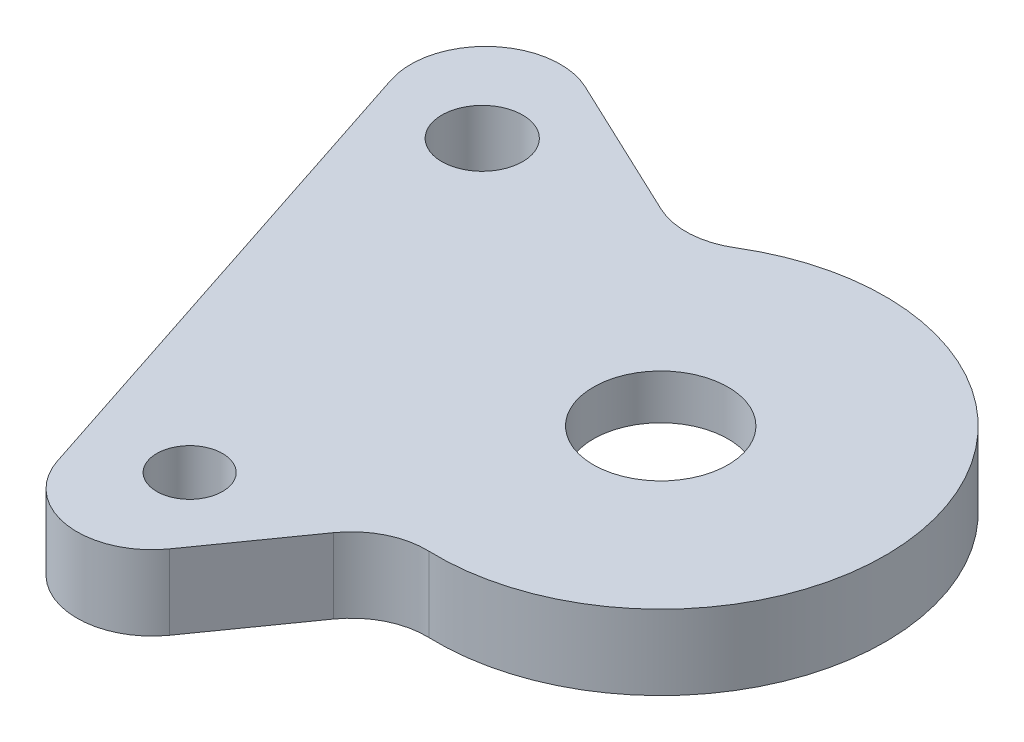
ISO-10303-21;
HEADER;
FILE_DESCRIPTION(('STEP AP214'),'2;1');
FILE_NAME('part.step','',(''),(''),'','','');
FILE_SCHEMA(('AUTOMOTIVE_DESIGN { 1 0 10303 214 1 1 1 1 }'));
ENDSEC;
DATA;
#1=APPLICATION_CONTEXT('core data for automotive mechanical design processes');
#2=APPLICATION_PROTOCOL_DEFINITION('international standard','automotive_design',2000,#1);
#3=PRODUCT_CONTEXT('',#1,'mechanical');
#4=PRODUCT('Part','Part','',(#3));
#5=PRODUCT_RELATED_PRODUCT_CATEGORY('part','',(#4));
#6=PRODUCT_DEFINITION_FORMATION('','',#4);
#7=PRODUCT_DEFINITION_CONTEXT('part definition',#1,'design');
#8=PRODUCT_DEFINITION('design','',#6,#7);
#9=PRODUCT_DEFINITION_SHAPE('','',#8);
#10=(LENGTH_UNIT() NAMED_UNIT(*) SI_UNIT(.MILLI.,.METRE.));
#11=(NAMED_UNIT(*) PLANE_ANGLE_UNIT() SI_UNIT($,.RADIAN.));
#12=(NAMED_UNIT(*) SI_UNIT($,.STERADIAN.) SOLID_ANGLE_UNIT());
#13=UNCERTAINTY_MEASURE_WITH_UNIT(LENGTH_MEASURE(1.E-05),#10,'distance_accuracy_value','');
#14=(GEOMETRIC_REPRESENTATION_CONTEXT(3) GLOBAL_UNCERTAINTY_ASSIGNED_CONTEXT((#13)) GLOBAL_UNIT_ASSIGNED_CONTEXT((#10,
#11,#12)) REPRESENTATION_CONTEXT('',''));
#15=CARTESIAN_POINT('',(0.,0.,0.));
#16=DIRECTION('',(0.,0.,1.));
#17=DIRECTION('',(1.,0.,0.));
#18=AXIS2_PLACEMENT_3D('',#15,#16,#17);
#19=CARTESIAN_POINT('',(0.,-25.,0.));
#20=DIRECTION('',(0.,1.,0.));
#21=DIRECTION('',(0.,0.,-1.));
#22=AXIS2_PLACEMENT_3D('',#19,#20,#21);
#23=CYLINDRICAL_SURFACE('',#22,12.);
#24=CARTESIAN_POINT('',(0.,-25.,0.));
#25=DIRECTION('',(0.,1.,0.));
#26=DIRECTION('',(0.,0.,1.));
#27=AXIS2_PLACEMENT_3D('',#24,#25,#26);
#28=CIRCLE('',#27,12.);
#29=CARTESIAN_POINT('',(-1.59644048502354,-25.,-11.8933333333333));
#30=VERTEX_POINT('',#29);
#31=CARTESIAN_POINT('',(-11.0981490448542,-25.,4.56410865100746));
#32=VERTEX_POINT('',#31);
#33=EDGE_CURVE('E149',#30,#32,#28,.T.);
#34=ORIENTED_EDGE('',*,*,#33,.F.);
#35=DIRECTION('',(0.,1.,0.));
#36=VECTOR('',#35,1.);
#37=CARTESIAN_POINT('',(-1.59644048502354,-28.7279048689119,-11.8933333333333));
#38=LINE('',#37,#36);
#39=CARTESIAN_POINT('',(-1.59644048502354,-22.,-11.8933333333333));
#40=VERTEX_POINT('',#39);
#41=EDGE_CURVE('E321',#30,#40,#38,.T.);
#42=ORIENTED_EDGE('',*,*,#41,.T.);
#43=CARTESIAN_POINT('',(0.,-22.,0.));
#44=DIRECTION('',(0.,1.,0.));
#45=DIRECTION('',(0.,0.,1.));
#46=AXIS2_PLACEMENT_3D('',#43,#44,#45);
#47=CIRCLE('',#46,12.);
#48=CARTESIAN_POINT('',(-11.0981490448542,-22.,4.56410865100746));
#49=VERTEX_POINT('',#48);
#50=EDGE_CURVE('E202',#40,#49,#47,.T.);
#51=ORIENTED_EDGE('',*,*,#50,.T.);
#52=DIRECTION('',(0.,1.,0.));
#53=VECTOR('',#52,1.);
#54=CARTESIAN_POINT('',(-11.0981490448542,-28.7279048689119,4.56410865100746));
#55=LINE('',#54,#53);
#56=EDGE_CURVE('E158',#32,#49,#55,.T.);
#57=ORIENTED_EDGE('',*,*,#56,.F.);
#58=EDGE_LOOP('',(#34,#42,#51,#57));
#59=FACE_BOUND('',#58,.T.);
#60=ADVANCED_FACE('F39',(#59),#23,.F.);
#61=CARTESIAN_POINT('',(-9.50170855983033,-22.,7.32922468232806));
#62=VERTEX_POINT('',#61);
#63=CARTESIAN_POINT('',(9.50170855983194,-22.,7.32922468232597));
#64=VERTEX_POINT('',#63);
#65=EDGE_CURVE('E206',#62,#64,#47,.T.);
#66=ORIENTED_EDGE('',*,*,#65,.T.);
#67=DIRECTION('',(0.,1.,0.));
#68=VECTOR('',#67,1.);
#69=CARTESIAN_POINT('',(9.50170855983194,-28.7279048689119,7.32922468232597));
#70=LINE('',#69,#68);
#71=CARTESIAN_POINT('',(9.50170855983195,-25.,7.32922468232596));
#72=VERTEX_POINT('',#71);
#73=EDGE_CURVE('E151',#72,#64,#70,.T.);
#74=ORIENTED_EDGE('',*,*,#73,.F.);
#75=CARTESIAN_POINT('',(-9.50170855983033,-25.,7.32922468232806));
#76=VERTEX_POINT('',#75);
#77=EDGE_CURVE('E146',#76,#72,#28,.T.);
#78=ORIENTED_EDGE('',*,*,#77,.F.);
#79=DIRECTION('',(0.,1.,0.));
#80=VECTOR('',#79,1.);
#81=CARTESIAN_POINT('',(-9.50170855983033,-28.7279048689119,7.32922468232806));
#82=LINE('',#81,#80);
#83=EDGE_CURVE('E153',#76,#62,#82,.T.);
#84=ORIENTED_EDGE('',*,*,#83,.T.);
#85=EDGE_LOOP('',(#66,#74,#78,#84));
#86=FACE_BOUND('',#85,.T.);
#87=ADVANCED_FACE('F160',(#86),#23,.F.);
#88=CARTESIAN_POINT('',(11.0981490448552,-22.,4.56410865100517));
#89=VERTEX_POINT('',#88);
#90=CARTESIAN_POINT('',(1.59644048502354,-22.,-11.8933333333333));
#91=VERTEX_POINT('',#90);
#92=EDGE_CURVE('E184',#89,#91,#47,.T.);
#93=ORIENTED_EDGE('',*,*,#92,.T.);
#94=DIRECTION('',(0.,1.,0.));
#95=VECTOR('',#94,1.);
#96=CARTESIAN_POINT('',(1.59644048502354,-28.7279048689119,-11.8933333333333));
#97=LINE('',#96,#95);
#98=CARTESIAN_POINT('',(1.59644048502355,-25.,-11.8933333333333));
#99=VERTEX_POINT('',#98);
#100=EDGE_CURVE('E306',#99,#91,#97,.T.);
#101=ORIENTED_EDGE('',*,*,#100,.F.);
#102=CARTESIAN_POINT('',(11.0981490448552,-25.,4.56410865100517));
#103=VERTEX_POINT('',#102);
#104=EDGE_CURVE('E161',#103,#99,#28,.T.);
#105=ORIENTED_EDGE('',*,*,#104,.F.);
#106=DIRECTION('',(0.,1.,0.));
#107=VECTOR('',#106,1.);
#108=CARTESIAN_POINT('',(11.0981490448552,-28.7279048689119,4.56410865100517));
#109=LINE('',#108,#107);
#110=EDGE_CURVE('E307',#103,#89,#109,.T.);
#111=ORIENTED_EDGE('',*,*,#110,.T.);
#112=EDGE_LOOP('',(#93,#101,#105,#111));
#113=FACE_BOUND('',#112,.T.);
#114=ADVANCED_FACE('F290',(#113),#23,.F.);
#115=CARTESIAN_POINT('',(4.89755338496311,-25.,3.4661175458193));
#116=DIRECTION('',(0.816258897493851,0.,0.57768625763655));
#117=DIRECTION('',(0.57768625763655,0.,-0.816258897493851));
#118=AXIS2_PLACEMENT_3D('',#115,#116,#117);
#119=PLANE('',#118);
#120=DIRECTION('',(-0.57768625763655,0.,0.816258897493851));
#121=VECTOR('',#120,1.);
#122=CARTESIAN_POINT('',(4.89755338496311,-20.,3.4661175458193));
#123=LINE('',#122,#121);
#124=CARTESIAN_POINT('',(-4.75170948953318,-20.,17.1003291467469));
#125=VERTEX_POINT('',#124);
#126=CARTESIAN_POINT('',(-9.29348969687176,-20.,23.5177719293896));
#127=VERTEX_POINT('',#126);
#128=EDGE_CURVE('E185',#125,#127,#123,.T.);
#129=ORIENTED_EDGE('',*,*,#128,.T.);
#130=DIRECTION('',(0.,1.,0.));
#131=VECTOR('',#130,1.);
#132=CARTESIAN_POINT('',(-9.29348969687176,-25.,23.5177719293896));
#133=LINE('',#132,#131);
#134=CARTESIAN_POINT('',(-9.29348969687176,-25.,23.5177719293896));
#135=VERTEX_POINT('',#134);
#136=EDGE_CURVE('E223',#135,#127,#133,.T.);
#137=ORIENTED_EDGE('',*,*,#136,.F.);
#138=DIRECTION('',(-0.57768625763655,0.,0.816258897493851));
#139=VECTOR('',#138,1.);
#140=CARTESIAN_POINT('',(4.89755338496311,-25.,3.4661175458193));
#141=LINE('',#140,#139);
#142=CARTESIAN_POINT('',(-4.75170948953318,-25.,17.1003291467469));
#143=VERTEX_POINT('',#142);
#144=EDGE_CURVE('E163',#143,#135,#141,.T.);
#145=ORIENTED_EDGE('',*,*,#144,.F.);
#146=DIRECTION('',(0.,1.,0.));
#147=VECTOR('',#146,1.);
#148=CARTESIAN_POINT('',(-4.75170948953318,-25.,17.1003291467469));
#149=LINE('',#148,#147);
#150=EDGE_CURVE('E235',#125,#143,#149,.F.);
#151=ORIENTED_EDGE('',*,*,#150,.F.);
#152=EDGE_LOOP('',(#129,#137,#145,#151));
#153=FACE_BOUND('',#152,.T.);
#154=ADVANCED_FACE('F261',(#153),#119,.T.);
#155=CARTESIAN_POINT('',(0.,-25.,0.));
#156=DIRECTION('',(0.,1.,0.));
#157=DIRECTION('',(0.,0.,-1.));
#158=AXIS2_PLACEMENT_3D('',#155,#156,#157);
#159=CYLINDRICAL_SURFACE('',#158,15.);
#160=CARTESIAN_POINT('',(0.,-20.,0.));
#161=DIRECTION('',(0.,1.,0.));
#162=DIRECTION('',(0.,0.,1.));
#163=AXIS2_PLACEMENT_3D('',#160,#161,#162);
#164=CIRCLE('',#163,15.);
#165=CARTESIAN_POINT('',(-0.502811251547942,-20.,14.9915703261972));
#166=VERTEX_POINT('',#165);
#167=CARTESIAN_POINT('',(-7.8028543625734,-20.,-12.8107557855292));
#168=VERTEX_POINT('',#167);
#169=EDGE_CURVE('E188',#166,#168,#164,.T.);
#170=ORIENTED_EDGE('',*,*,#169,.F.);
#171=DIRECTION('',(0.,1.,0.));
#172=VECTOR('',#171,1.);
#173=CARTESIAN_POINT('',(-0.502811251547942,-25.,14.9915703261972));
#174=LINE('',#173,#172);
#175=CARTESIAN_POINT('',(-0.502811251547942,-25.,14.9915703261972));
#176=VERTEX_POINT('',#175);
#177=EDGE_CURVE('E229',#176,#166,#174,.T.);
#178=ORIENTED_EDGE('',*,*,#177,.F.);
#179=CARTESIAN_POINT('',(0.,-25.,0.));
#180=DIRECTION('',(0.,1.,0.));
#181=DIRECTION('',(0.,0.,1.));
#182=AXIS2_PLACEMENT_3D('',#179,#180,#181);
#183=CIRCLE('',#182,15.);
#184=CARTESIAN_POINT('',(-7.8028543625734,-25.,-12.8107557855292));
#185=VERTEX_POINT('',#184);
#186=EDGE_CURVE('E172',#176,#185,#183,.T.);
#187=ORIENTED_EDGE('',*,*,#186,.T.);
#188=DIRECTION('',(0.,1.,0.));
#189=VECTOR('',#188,1.);
#190=CARTESIAN_POINT('',(-7.8028543625734,-25.,-12.8107557855292));
#191=LINE('',#190,#189);
#192=EDGE_CURVE('E232',#168,#185,#191,.F.);
#193=ORIENTED_EDGE('',*,*,#192,.F.);
#194=EDGE_LOOP('',(#170,#178,#187,#193));
#195=FACE_BOUND('',#194,.T.);
#196=ADVANCED_FACE('F253',(#195),#159,.T.);
#197=CARTESIAN_POINT('',(2.56300821164913,-25.,-5.42503353971376));
#198=DIRECTION('',(0.427168035274854,0.,-0.904172256618959));
#199=DIRECTION('',(-0.904172256618959,0.,-0.427168035274854));
#200=AXIS2_PLACEMENT_3D('',#197,#198,#199);
#201=PLANE('',#200);
#202=DIRECTION('',(0.904172256618959,0.,0.427168035274854));
#203=VECTOR('',#202,1.);
#204=CARTESIAN_POINT('',(2.56300821164913,-25.,-5.42503353971376));
#205=LINE('',#204,#203);
#206=CARTESIAN_POINT('',(-22.1442331079006,-25.,-17.097747067775));
#207=VERTEX_POINT('',#206);
#208=CARTESIAN_POINT('',(-12.5396459931388,-25.,-12.5601464309441));
#209=VERTEX_POINT('',#208);
#210=EDGE_CURVE('E175',#207,#209,#205,.T.);
#211=ORIENTED_EDGE('',*,*,#210,.F.);
#212=DIRECTION('',(0.,1.,0.));
#213=VECTOR('',#212,1.);
#214=CARTESIAN_POINT('',(-22.1442331079006,-25.,-17.097747067775));
#215=LINE('',#214,#213);
#216=CARTESIAN_POINT('',(-22.1442331079006,-20.,-17.097747067775));
#217=VERTEX_POINT('',#216);
#218=EDGE_CURVE('E216',#217,#207,#215,.F.);
#219=ORIENTED_EDGE('',*,*,#218,.F.);
#220=DIRECTION('',(0.904172256618959,0.,0.427168035274854));
#221=VECTOR('',#220,1.);
#222=CARTESIAN_POINT('',(2.56300821164913,-20.,-5.42503353971376));
#223=LINE('',#222,#221);
#224=CARTESIAN_POINT('',(-12.5396459931388,-20.,-12.5601464309441));
#225=VERTEX_POINT('',#224);
#226=EDGE_CURVE('E191',#217,#225,#223,.T.);
#227=ORIENTED_EDGE('',*,*,#226,.T.);
#228=DIRECTION('',(0.,1.,0.));
#229=VECTOR('',#228,1.);
#230=CARTESIAN_POINT('',(-12.5396459931388,-25.,-12.5601464309441));
#231=LINE('',#230,#229);
#232=EDGE_CURVE('E226',#209,#225,#231,.T.);
#233=ORIENTED_EDGE('',*,*,#232,.F.);
#234=EDGE_LOOP('',(#211,#219,#227,#233));
#235=FACE_BOUND('',#234,.T.);
#236=ADVANCED_FACE('F276',(#235),#201,.T.);
#237=CARTESIAN_POINT('',(-13.0441556974333,-25.,18.4311259054112));
#238=DIRECTION('',(0.,1.,0.));
#239=DIRECTION('',(0.,0.,-1.));
#240=AXIS2_PLACEMENT_3D('',#237,#238,#239);
#241=CYLINDRICAL_SURFACE('',#240,2.2);
#242=CARTESIAN_POINT('',(-13.0441556974333,-25.,18.4311259054112));
#243=DIRECTION('',(0.,1.,0.));
#244=DIRECTION('',(0.,0.,1.));
#245=AXIS2_PLACEMENT_3D('',#242,#243,#244);
#246=CIRCLE('',#245,2.2);
#247=CARTESIAN_POINT('',(-13.0441556974333,-25.,20.6311259054112));
#248=VERTEX_POINT('',#247);
#249=EDGE_CURVE('E181',#248,#248,#246,.T.);
#250=ORIENTED_EDGE('',*,*,#249,.F.);
#251=EDGE_LOOP('',(#250));
#252=FACE_BOUND('',#251,.T.);
#253=CARTESIAN_POINT('',(-13.0441556974333,-20.,18.4311259054112));
#254=DIRECTION('',(0.,1.,0.));
#255=DIRECTION('',(0.,0.,1.));
#256=AXIS2_PLACEMENT_3D('',#253,#254,#255);
#257=CIRCLE('',#256,2.2);
#258=CARTESIAN_POINT('',(-13.0441556974333,-20.,20.6311259054112));
#259=VERTEX_POINT('',#258);
#260=EDGE_CURVE('E197',#259,#259,#257,.T.);
#261=ORIENTED_EDGE('',*,*,#260,.T.);
#262=EDGE_LOOP('',(#261));
#263=FACE_BOUND('',#262,.T.);
#264=ADVANCED_FACE('F361',(#252,#263),#241,.F.);
#265=CARTESIAN_POINT('',(-22.9384223712889,-25.,7.53322958914367));
#266=DIRECTION('',(-0.950076947783487,0.,0.31201569398095));
#267=DIRECTION('',(0.31201569398095,0.,0.950076947783487));
#268=AXIS2_PLACEMENT_3D('',#265,#266,#267);
#269=PLANE('',#268);
#270=DIRECTION('',(-0.31201569398095,0.,-0.950076947783487));
#271=VECTOR('',#270,1.);
#272=CARTESIAN_POINT('',(-22.9384223712889,-25.,7.53322958914367));
#273=LINE('',#272,#271);
#274=CARTESIAN_POINT('',(-18.1251689232584,-25.,22.1894191111116));
#275=VERTEX_POINT('',#274);
#276=CARTESIAN_POINT('',(-29.0304580231923,-25.,-11.0168073147754));
#277=VERTEX_POINT('',#276);
#278=EDGE_CURVE('E178',#275,#277,#273,.T.);
#279=ORIENTED_EDGE('',*,*,#278,.F.);
#280=DIRECTION('',(0.,1.,0.));
#281=VECTOR('',#280,1.);
#282=CARTESIAN_POINT('',(-18.1251689232584,-25.,22.1894191111116));
#283=LINE('',#282,#281);
#284=CARTESIAN_POINT('',(-18.1251689232584,-20.,22.1894191111116));
#285=VERTEX_POINT('',#284);
#286=EDGE_CURVE('E205',#285,#275,#283,.F.);
#287=ORIENTED_EDGE('',*,*,#286,.F.);
#288=DIRECTION('',(-0.31201569398095,0.,-0.950076947783487));
#289=VECTOR('',#288,1.);
#290=CARTESIAN_POINT('',(-22.9384223712889,-20.,7.53322958914367));
#291=LINE('',#290,#289);
#292=CARTESIAN_POINT('',(-29.0304580231923,-20.,-11.0168073147754));
#293=VERTEX_POINT('',#292);
#294=EDGE_CURVE('E194',#285,#293,#291,.T.);
#295=ORIENTED_EDGE('',*,*,#294,.T.);
#296=DIRECTION('',(0.,1.,0.));
#297=VECTOR('',#296,1.);
#298=CARTESIAN_POINT('',(-29.0304580231923,-25.,-11.0168073147754));
#299=LINE('',#298,#297);
#300=EDGE_CURVE('E209',#277,#293,#299,.T.);
#301=ORIENTED_EDGE('',*,*,#300,.F.);
#302=EDGE_LOOP('',(#279,#287,#295,#301));
#303=FACE_BOUND('',#302,.T.);
#304=ADVANCED_FACE('F269',(#303),#269,.T.);
#305=CARTESIAN_POINT('',(-22.604306415474,-25.,-10.6792008818714));
#306=DIRECTION('',(0.,1.,0.));
#307=DIRECTION('',(0.,0.,-1.));
#308=AXIS2_PLACEMENT_3D('',#305,#306,#307);
#309=CYLINDRICAL_SURFACE('',#308,2.7);
#310=CARTESIAN_POINT('',(-22.604306415474,-20.,-10.6792008818714));
#311=DIRECTION('',(0.,1.,0.));
#312=DIRECTION('',(0.,0.,1.));
#313=AXIS2_PLACEMENT_3D('',#310,#311,#312);
#314=CIRCLE('',#313,2.7);
#315=CARTESIAN_POINT('',(-22.604306415474,-20.,-7.97920088187135));
#316=VERTEX_POINT('',#315);
#317=EDGE_CURVE('E165',#316,#316,#314,.T.);
#318=ORIENTED_EDGE('',*,*,#317,.T.);
#319=EDGE_LOOP('',(#318));
#320=FACE_BOUND('',#319,.T.);
#321=CARTESIAN_POINT('',(-22.604306415474,-26.,-10.6792008818714));
#322=DIRECTION('',(0.,1.,0.));
#323=DIRECTION('',(0.,0.,1.));
#324=AXIS2_PLACEMENT_3D('',#321,#322,#323);
#325=CIRCLE('',#324,2.7);
#326=CARTESIAN_POINT('',(-22.604306415474,-26.,-7.97920088187135));
#327=VERTEX_POINT('',#326);
#328=EDGE_CURVE('E333',#327,#327,#325,.F.);
#329=ORIENTED_EDGE('',*,*,#328,.T.);
#330=EDGE_LOOP('',(#329));
#331=FACE_BOUND('',#330,.T.);
#332=ADVANCED_FACE('F354',(#320,#331),#309,.F.);
#333=CARTESIAN_POINT('',(0.,-25.,0.));
#334=DIRECTION('',(0.,-1.,0.));
#335=DIRECTION('',(0.,0.,1.));
#336=AXIS2_PLACEMENT_3D('',#333,#334,#335);
#337=PLANE('',#336);
#338=CARTESIAN_POINT('',(-22.604306415474,-25.,-10.6792008818714));
#339=DIRECTION('',(0.,1.,0.));
#340=DIRECTION('',(0.,0.,1.));
#341=AXIS2_PLACEMENT_3D('',#338,#339,#340);
#342=CIRCLE('',#341,5.7);
#343=CARTESIAN_POINT('',(-22.604306415474,-25.,-4.97920088187135));
#344=VERTEX_POINT('',#343);
#345=EDGE_CURVE('E11',#344,#344,#342,.F.);
#346=ORIENTED_EDGE('',*,*,#345,.F.);
#347=EDGE_LOOP('',(#346));
#348=FACE_BOUND('',#347,.T.);
#349=ORIENTED_EDGE('',*,*,#33,.T.);
#350=CARTESIAN_POINT('',(-10.392304845412,-25.,6.00000000000074));
#351=DIRECTION('',(0.,1.,0.));
#352=DIRECTION('',(0.,0.,1.));
#353=AXIS2_PLACEMENT_3D('',#350,#351,#352);
#354=CIRCLE('',#353,1.6);
#355=EDGE_CURVE('E142',#76,#32,#354,.T.);
#356=ORIENTED_EDGE('',*,*,#355,.F.);
#357=ORIENTED_EDGE('',*,*,#77,.T.);
#358=CARTESIAN_POINT('',(10.3923048454145,-25.,5.99999999999926));
#359=DIRECTION('',(0.,1.,0.));
#360=DIRECTION('',(0.,0.,1.));
#361=AXIS2_PLACEMENT_3D('',#358,#359,#360);
#362=CIRCLE('',#361,1.6);
#363=EDGE_CURVE('E311',#103,#72,#362,.T.);
#364=ORIENTED_EDGE('',*,*,#363,.F.);
#365=ORIENTED_EDGE('',*,*,#104,.T.);
#366=CARTESIAN_POINT('',(0.,-25.,-12.));
#367=DIRECTION('',(0.,1.,0.));
#368=DIRECTION('',(0.,0.,1.));
#369=AXIS2_PLACEMENT_3D('',#366,#367,#368);
#370=CIRCLE('',#369,1.6);
#371=EDGE_CURVE('E320',#30,#99,#370,.T.);
#372=ORIENTED_EDGE('',*,*,#371,.F.);
#373=EDGE_LOOP('',(#349,#356,#357,#364,#365,#372));
#374=FACE_BOUND('',#373,.T.);
#375=ORIENTED_EDGE('',*,*,#210,.T.);
#376=CARTESIAN_POINT('',(-10.4038058167645,-25.,-17.0810077140389));
#377=DIRECTION('',(0.,1.,0.));
#378=DIRECTION('',(0.,0.,1.));
#379=AXIS2_PLACEMENT_3D('',#376,#377,#378);
#380=CIRCLE('',#379,5.);
#381=EDGE_CURVE('E240',#185,#209,#380,.F.);
#382=ORIENTED_EDGE('',*,*,#381,.F.);
#383=ORIENTED_EDGE('',*,*,#186,.F.);
#384=CARTESIAN_POINT('',(-0.670415002063923,-25.,19.9887604349296));
#385=DIRECTION('',(0.,1.,0.));
#386=DIRECTION('',(0.,0.,1.));
#387=AXIS2_PLACEMENT_3D('',#384,#385,#386);
#388=CIRCLE('',#387,5.);
#389=EDGE_CURVE('E47',#143,#176,#388,.F.);
#390=ORIENTED_EDGE('',*,*,#389,.F.);
#391=ORIENTED_EDGE('',*,*,#144,.T.);
#392=CARTESIAN_POINT('',(-13.374784184341,-25.,20.6293406412069));
#393=DIRECTION('',(0.,1.,0.));
#394=DIRECTION('',(0.,0.,1.));
#395=AXIS2_PLACEMENT_3D('',#392,#393,#394);
#396=CIRCLE('',#395,5.);
#397=EDGE_CURVE('E219',#275,#135,#396,.T.);
#398=ORIENTED_EDGE('',*,*,#397,.F.);
#399=ORIENTED_EDGE('',*,*,#278,.T.);
#400=CARTESIAN_POINT('',(-24.2800732842749,-25.,-12.5768857846802));
#401=DIRECTION('',(0.,1.,0.));
#402=DIRECTION('',(0.,0.,1.));
#403=AXIS2_PLACEMENT_3D('',#400,#401,#402);
#404=CIRCLE('',#403,5.);
#405=EDGE_CURVE('E221',#207,#277,#404,.T.);
#406=ORIENTED_EDGE('',*,*,#405,.F.);
#407=EDGE_LOOP('',(#375,#382,#383,#390,#391,#398,#399,#406));
#408=FACE_BOUND('',#407,.T.);
#409=ORIENTED_EDGE('',*,*,#249,.T.);
#410=EDGE_LOOP('',(#409));
#411=FACE_BOUND('',#410,.T.);
#412=ADVANCED_FACE('F143',(#348,#374,#408,#411),#337,.T.);
#413=CARTESIAN_POINT('',(0.,-20.,0.));
#414=DIRECTION('',(0.,-1.,0.));
#415=DIRECTION('',(0.,0.,1.));
#416=AXIS2_PLACEMENT_3D('',#413,#414,#415);
#417=PLANE('',#416);
#418=ORIENTED_EDGE('',*,*,#294,.F.);
#419=CARTESIAN_POINT('',(-13.374784184341,-20.,20.6293406412069));
#420=DIRECTION('',(0.,1.,0.));
#421=DIRECTION('',(0.,0.,1.));
#422=AXIS2_PLACEMENT_3D('',#419,#420,#421);
#423=CIRCLE('',#422,5.);
#424=EDGE_CURVE('E212',#127,#285,#423,.F.);
#425=ORIENTED_EDGE('',*,*,#424,.F.);
#426=ORIENTED_EDGE('',*,*,#128,.F.);
#427=CARTESIAN_POINT('',(-0.670415002063923,-20.,19.9887604349296));
#428=DIRECTION('',(0.,1.,0.));
#429=DIRECTION('',(0.,0.,1.));
#430=AXIS2_PLACEMENT_3D('',#427,#428,#429);
#431=CIRCLE('',#430,5.);
#432=EDGE_CURVE('E242',#166,#125,#431,.T.);
#433=ORIENTED_EDGE('',*,*,#432,.F.);
#434=ORIENTED_EDGE('',*,*,#169,.T.);
#435=CARTESIAN_POINT('',(-10.4038058167645,-20.,-17.0810077140389));
#436=DIRECTION('',(0.,1.,0.));
#437=DIRECTION('',(0.,0.,1.));
#438=AXIS2_PLACEMENT_3D('',#435,#436,#437);
#439=CIRCLE('',#438,5.);
#440=EDGE_CURVE('E238',#225,#168,#439,.T.);
#441=ORIENTED_EDGE('',*,*,#440,.F.);
#442=ORIENTED_EDGE('',*,*,#226,.F.);
#443=CARTESIAN_POINT('',(-24.2800732842749,-20.,-12.5768857846802));
#444=DIRECTION('',(0.,1.,0.));
#445=DIRECTION('',(0.,0.,1.));
#446=AXIS2_PLACEMENT_3D('',#443,#444,#445);
#447=CIRCLE('',#446,5.);
#448=EDGE_CURVE('E214',#293,#217,#447,.F.);
#449=ORIENTED_EDGE('',*,*,#448,.F.);
#450=EDGE_LOOP('',(#418,#425,#426,#433,#434,#441,#442,#449));
#451=FACE_BOUND('',#450,.T.);
#452=ORIENTED_EDGE('',*,*,#260,.F.);
#453=EDGE_LOOP('',(#452));
#454=FACE_BOUND('',#453,.T.);
#455=ORIENTED_EDGE('',*,*,#317,.F.);
#456=EDGE_LOOP('',(#455));
#457=FACE_BOUND('',#456,.T.);
#458=CARTESIAN_POINT('',(0.,-20.,0.));
#459=DIRECTION('',(0.,1.,0.));
#460=DIRECTION('',(0.,0.,1.));
#461=AXIS2_PLACEMENT_3D('',#458,#459,#460);
#462=CIRCLE('',#461,4.5);
#463=CARTESIAN_POINT('',(0.,-20.,4.5));
#464=VERTEX_POINT('',#463);
#465=EDGE_CURVE('E168',#464,#464,#462,.T.);
#466=ORIENTED_EDGE('',*,*,#465,.F.);
#467=EDGE_LOOP('',(#466));
#468=FACE_BOUND('',#467,.T.);
#469=ADVANCED_FACE('F256',(#451,#454,#457,#468),#417,.F.);
#470=CARTESIAN_POINT('',(0.,-22.,0.));
#471=DIRECTION('',(0.,1.,0.));
#472=DIRECTION('',(0.,0.,-1.));
#473=AXIS2_PLACEMENT_3D('',#470,#471,#472);
#474=CYLINDRICAL_SURFACE('',#473,4.5);
#475=ORIENTED_EDGE('',*,*,#465,.T.);
#476=EDGE_LOOP('',(#475));
#477=FACE_BOUND('',#476,.T.);
#478=CARTESIAN_POINT('',(0.,-23.,0.));
#479=DIRECTION('',(0.,1.,0.));
#480=DIRECTION('',(0.,0.,1.));
#481=AXIS2_PLACEMENT_3D('',#478,#479,#480);
#482=CIRCLE('',#481,4.5);
#483=CARTESIAN_POINT('',(0.,-23.,4.5));
#484=VERTEX_POINT('',#483);
#485=EDGE_CURVE('E327',#484,#484,#482,.F.);
#486=ORIENTED_EDGE('',*,*,#485,.T.);
#487=EDGE_LOOP('',(#486));
#488=FACE_BOUND('',#487,.T.);
#489=ADVANCED_FACE('F344',(#477,#488),#474,.F.);
#490=CARTESIAN_POINT('',(0.,-22.,0.));
#491=DIRECTION('',(0.,-1.,0.));
#492=DIRECTION('',(0.,0.,1.));
#493=AXIS2_PLACEMENT_3D('',#490,#491,#492);
#494=PLANE('',#493);
#495=CARTESIAN_POINT('',(0.,-22.,0.));
#496=DIRECTION('',(0.,1.,0.));
#497=DIRECTION('',(0.,0.,1.));
#498=AXIS2_PLACEMENT_3D('',#495,#496,#497);
#499=CIRCLE('',#498,6.5);
#500=CARTESIAN_POINT('',(0.,-22.,6.5));
#501=VERTEX_POINT('',#500);
#502=EDGE_CURVE('E323',#501,#501,#499,.T.);
#503=ORIENTED_EDGE('',*,*,#502,.T.);
#504=EDGE_LOOP('',(#503));
#505=FACE_BOUND('',#504,.T.);
#506=ORIENTED_EDGE('',*,*,#50,.F.);
#507=CARTESIAN_POINT('',(0.,-22.,-12.));
#508=DIRECTION('',(0.,1.,0.));
#509=DIRECTION('',(0.,0.,1.));
#510=AXIS2_PLACEMENT_3D('',#507,#508,#509);
#511=CIRCLE('',#510,1.6);
#512=EDGE_CURVE('E318',#40,#91,#511,.T.);
#513=ORIENTED_EDGE('',*,*,#512,.T.);
#514=ORIENTED_EDGE('',*,*,#92,.F.);
#515=CARTESIAN_POINT('',(10.3923048454145,-22.,5.99999999999926));
#516=DIRECTION('',(0.,1.,0.));
#517=DIRECTION('',(0.,0.,1.));
#518=AXIS2_PLACEMENT_3D('',#515,#516,#517);
#519=CIRCLE('',#518,1.6);
#520=EDGE_CURVE('E62',#89,#64,#519,.T.);
#521=ORIENTED_EDGE('',*,*,#520,.T.);
#522=ORIENTED_EDGE('',*,*,#65,.F.);
#523=CARTESIAN_POINT('',(-10.392304845412,-22.,6.00000000000074));
#524=DIRECTION('',(0.,1.,0.));
#525=DIRECTION('',(0.,0.,1.));
#526=AXIS2_PLACEMENT_3D('',#523,#524,#525);
#527=CIRCLE('',#526,1.6);
#528=EDGE_CURVE('E54',#62,#49,#527,.T.);
#529=ORIENTED_EDGE('',*,*,#528,.T.);
#530=EDGE_LOOP('',(#506,#513,#514,#521,#522,#529));
#531=FACE_BOUND('',#530,.T.);
#532=ADVANCED_FACE('F310',(#505,#531),#494,.T.);
#533=CARTESIAN_POINT('',(-24.2800732842749,-25.,-12.5768857846802));
#534=DIRECTION('',(0.,1.,0.));
#535=DIRECTION('',(0.,0.,-1.));
#536=AXIS2_PLACEMENT_3D('',#533,#534,#535);
#537=CYLINDRICAL_SURFACE('',#536,5.);
#538=ORIENTED_EDGE('',*,*,#405,.T.);
#539=ORIENTED_EDGE('',*,*,#300,.T.);
#540=ORIENTED_EDGE('',*,*,#448,.T.);
#541=ORIENTED_EDGE('',*,*,#218,.T.);
#542=EDGE_LOOP('',(#538,#539,#540,#541));
#543=FACE_BOUND('',#542,.T.);
#544=ADVANCED_FACE('F271',(#543),#537,.T.);
#545=CARTESIAN_POINT('',(-13.374784184341,-25.,20.6293406412069));
#546=DIRECTION('',(0.,1.,0.));
#547=DIRECTION('',(0.,0.,-1.));
#548=AXIS2_PLACEMENT_3D('',#545,#546,#547);
#549=CYLINDRICAL_SURFACE('',#548,5.);
#550=ORIENTED_EDGE('',*,*,#397,.T.);
#551=ORIENTED_EDGE('',*,*,#136,.T.);
#552=ORIENTED_EDGE('',*,*,#424,.T.);
#553=ORIENTED_EDGE('',*,*,#286,.T.);
#554=EDGE_LOOP('',(#550,#551,#552,#553));
#555=FACE_BOUND('',#554,.T.);
#556=ADVANCED_FACE('F266',(#555),#549,.T.);
#557=CARTESIAN_POINT('',(-10.4038058167645,-25.,-17.0810077140389));
#558=DIRECTION('',(0.,1.,0.));
#559=DIRECTION('',(0.,0.,-1.));
#560=AXIS2_PLACEMENT_3D('',#557,#558,#559);
#561=CYLINDRICAL_SURFACE('',#560,5.);
#562=ORIENTED_EDGE('',*,*,#381,.T.);
#563=ORIENTED_EDGE('',*,*,#232,.T.);
#564=ORIENTED_EDGE('',*,*,#440,.T.);
#565=ORIENTED_EDGE('',*,*,#192,.T.);
#566=EDGE_LOOP('',(#562,#563,#564,#565));
#567=FACE_BOUND('',#566,.T.);
#568=ADVANCED_FACE('F278',(#567),#561,.F.);
#569=CARTESIAN_POINT('',(-0.670415002063923,-25.,19.9887604349296));
#570=DIRECTION('',(0.,1.,0.));
#571=DIRECTION('',(0.,0.,-1.));
#572=AXIS2_PLACEMENT_3D('',#569,#570,#571);
#573=CYLINDRICAL_SURFACE('',#572,5.);
#574=ORIENTED_EDGE('',*,*,#389,.T.);
#575=ORIENTED_EDGE('',*,*,#177,.T.);
#576=ORIENTED_EDGE('',*,*,#432,.T.);
#577=ORIENTED_EDGE('',*,*,#150,.T.);
#578=EDGE_LOOP('',(#574,#575,#576,#577));
#579=FACE_BOUND('',#578,.T.);
#580=ADVANCED_FACE('F245',(#579),#573,.F.);
#581=CARTESIAN_POINT('',(0.,-26.,0.));
#582=DIRECTION('',(0.,-1.,0.));
#583=DIRECTION('',(0.,0.,1.));
#584=AXIS2_PLACEMENT_3D('',#581,#582,#583);
#585=PLANE('',#584);
#586=ORIENTED_EDGE('',*,*,#328,.F.);
#587=EDGE_LOOP('',(#586));
#588=FACE_BOUND('',#587,.T.);
#589=CARTESIAN_POINT('',(-22.604306415474,-26.,-10.6792008818714));
#590=DIRECTION('',(0.,1.,0.));
#591=DIRECTION('',(0.,0.,1.));
#592=AXIS2_PLACEMENT_3D('',#589,#590,#591);
#593=CIRCLE('',#592,4.7);
#594=CARTESIAN_POINT('',(-22.604306415474,-26.,-5.97920088187135));
#595=VERTEX_POINT('',#594);
#596=EDGE_CURVE('E337',#595,#595,#593,.T.);
#597=ORIENTED_EDGE('',*,*,#596,.F.);
#598=EDGE_LOOP('',(#597));
#599=FACE_BOUND('',#598,.T.);
#600=ADVANCED_FACE('F285',(#588,#599),#585,.T.);
#601=CARTESIAN_POINT('',(-22.604306415474,-26.,-10.6792008818714));
#602=DIRECTION('',(0.,-1.,0.));
#603=DIRECTION('',(0.,0.,1.));
#604=AXIS2_PLACEMENT_3D('',#601,#602,#603);
#605=TOROIDAL_SURFACE('',#604,5.7,1.);
#606=ORIENTED_EDGE('',*,*,#345,.T.);
#607=EDGE_LOOP('',(#606));
#608=FACE_BOUND('',#607,.T.);
#609=ORIENTED_EDGE('',*,*,#596,.T.);
#610=EDGE_LOOP('',(#609));
#611=FACE_BOUND('',#610,.T.);
#612=ADVANCED_FACE('F41',(#608,#611),#605,.F.);
#613=CARTESIAN_POINT('',(0.,-23.,0.));
#614=DIRECTION('',(0.,1.,0.));
#615=DIRECTION('',(0.,0.,-1.));
#616=AXIS2_PLACEMENT_3D('',#613,#614,#615);
#617=CYLINDRICAL_SURFACE('',#616,6.5);
#618=CARTESIAN_POINT('',(0.,-23.,0.));
#619=DIRECTION('',(0.,1.,0.));
#620=DIRECTION('',(0.,0.,1.));
#621=AXIS2_PLACEMENT_3D('',#618,#619,#620);
#622=CIRCLE('',#621,6.5);
#623=CARTESIAN_POINT('',(0.,-23.,6.5));
#624=VERTEX_POINT('',#623);
#625=EDGE_CURVE('E330',#624,#624,#622,.T.);
#626=ORIENTED_EDGE('',*,*,#625,.T.);
#627=EDGE_LOOP('',(#626));
#628=FACE_BOUND('',#627,.T.);
#629=ORIENTED_EDGE('',*,*,#502,.F.);
#630=EDGE_LOOP('',(#629));
#631=FACE_BOUND('',#630,.T.);
#632=ADVANCED_FACE('F460',(#628,#631),#617,.T.);
#633=CARTESIAN_POINT('',(0.,-23.,0.));
#634=DIRECTION('',(0.,-1.,0.));
#635=DIRECTION('',(0.,0.,1.));
#636=AXIS2_PLACEMENT_3D('',#633,#634,#635);
#637=PLANE('',#636);
#638=ORIENTED_EDGE('',*,*,#485,.F.);
#639=EDGE_LOOP('',(#638));
#640=FACE_BOUND('',#639,.T.);
#641=ORIENTED_EDGE('',*,*,#625,.F.);
#642=EDGE_LOOP('',(#641));
#643=FACE_BOUND('',#642,.T.);
#644=ADVANCED_FACE('F469',(#640,#643),#637,.T.);
#645=CARTESIAN_POINT('',(0.,-28.7279048689119,-12.));
#646=DIRECTION('',(0.,1.,0.));
#647=DIRECTION('',(0.,0.,-1.));
#648=AXIS2_PLACEMENT_3D('',#645,#646,#647);
#649=CYLINDRICAL_SURFACE('',#648,1.6);
#650=ORIENTED_EDGE('',*,*,#371,.T.);
#651=ORIENTED_EDGE('',*,*,#100,.T.);
#652=ORIENTED_EDGE('',*,*,#512,.F.);
#653=ORIENTED_EDGE('',*,*,#41,.F.);
#654=EDGE_LOOP('',(#650,#651,#652,#653));
#655=FACE_BOUND('',#654,.T.);
#656=ADVANCED_FACE('F479',(#655),#649,.T.);
#657=CARTESIAN_POINT('',(10.3923048454145,-28.7279048689119,5.99999999999926));
#658=DIRECTION('',(0.,1.,0.));
#659=DIRECTION('',(0.,0.,-1.));
#660=AXIS2_PLACEMENT_3D('',#657,#658,#659);
#661=CYLINDRICAL_SURFACE('',#660,1.6);
#662=ORIENTED_EDGE('',*,*,#363,.T.);
#663=ORIENTED_EDGE('',*,*,#73,.T.);
#664=ORIENTED_EDGE('',*,*,#520,.F.);
#665=ORIENTED_EDGE('',*,*,#110,.F.);
#666=EDGE_LOOP('',(#662,#663,#664,#665));
#667=FACE_BOUND('',#666,.T.);
#668=ADVANCED_FACE('F313',(#667),#661,.T.);
#669=CARTESIAN_POINT('',(-10.392304845412,-28.7279048689119,6.00000000000074));
#670=DIRECTION('',(0.,1.,0.));
#671=DIRECTION('',(0.,0.,-1.));
#672=AXIS2_PLACEMENT_3D('',#669,#670,#671);
#673=CYLINDRICAL_SURFACE('',#672,1.6);
#674=ORIENTED_EDGE('',*,*,#355,.T.);
#675=ORIENTED_EDGE('',*,*,#56,.T.);
#676=ORIENTED_EDGE('',*,*,#528,.F.);
#677=ORIENTED_EDGE('',*,*,#83,.F.);
#678=EDGE_LOOP('',(#674,#675,#676,#677));
#679=FACE_BOUND('',#678,.T.);
#680=ADVANCED_FACE('F154',(#679),#673,.T.);
#681=CLOSED_SHELL('',(#60,#87,#114,#154,#196,#236,#264,#304,#332,#412,#469,#489,#532,#544,#556,
#568,#580,#600,#612,#632,#644,#656,#668,#680));
#682=MANIFOLD_SOLID_BREP('B2',#681);
#683=ADVANCED_BREP_SHAPE_REPRESENTATION('',(#18,#682),#14);
#684=SHAPE_DEFINITION_REPRESENTATION(#9,#683);
ENDSEC;
END-ISO-10303-21;
